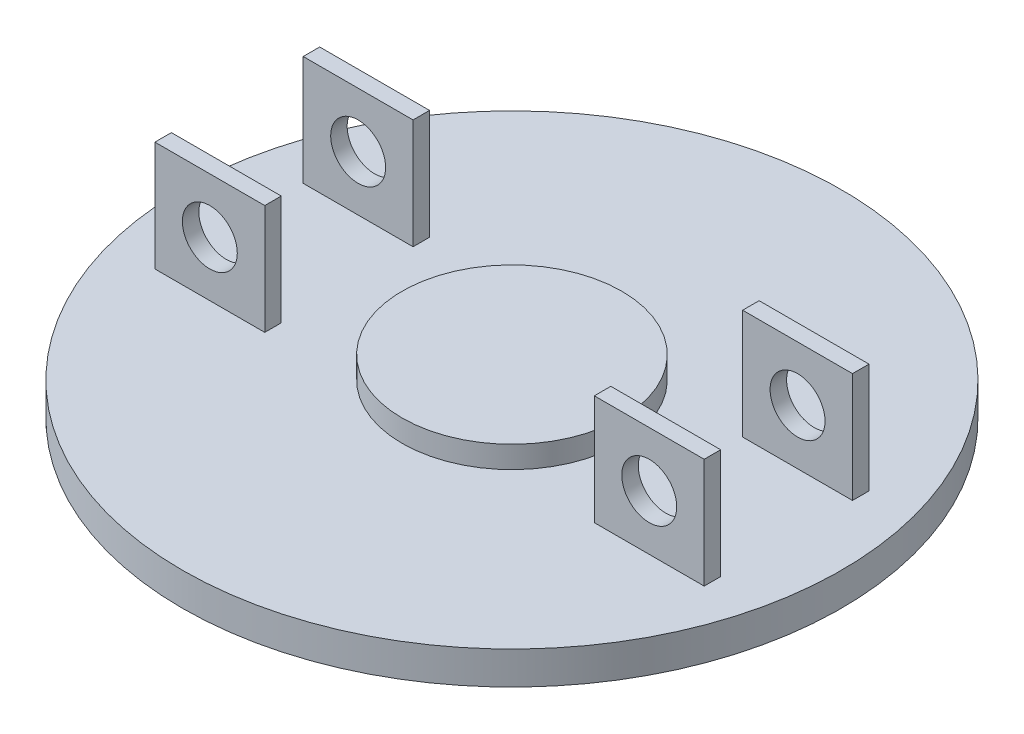
ISO-10303-21;
HEADER;
FILE_DESCRIPTION(('STEP AP214'),'2;1');
FILE_NAME('part.step','',(''),(''),'','','');
FILE_SCHEMA(('AUTOMOTIVE_DESIGN { 1 0 10303 214 1 1 1 1 }'));
ENDSEC;
DATA;
#1=APPLICATION_CONTEXT('core data for automotive mechanical design processes');
#2=APPLICATION_PROTOCOL_DEFINITION('international standard','automotive_design',2000,#1);
#3=PRODUCT_CONTEXT('',#1,'mechanical');
#4=PRODUCT('Part','Part','',(#3));
#5=PRODUCT_RELATED_PRODUCT_CATEGORY('part','',(#4));
#6=PRODUCT_DEFINITION_FORMATION('','',#4);
#7=PRODUCT_DEFINITION_CONTEXT('part definition',#1,'design');
#8=PRODUCT_DEFINITION('design','',#6,#7);
#9=PRODUCT_DEFINITION_SHAPE('','',#8);
#10=(LENGTH_UNIT() NAMED_UNIT(*) SI_UNIT(.MILLI.,.METRE.));
#11=(NAMED_UNIT(*) PLANE_ANGLE_UNIT() SI_UNIT($,.RADIAN.));
#12=(NAMED_UNIT(*) SI_UNIT($,.STERADIAN.) SOLID_ANGLE_UNIT());
#13=UNCERTAINTY_MEASURE_WITH_UNIT(LENGTH_MEASURE(1.E-05),#10,'distance_accuracy_value','');
#14=(GEOMETRIC_REPRESENTATION_CONTEXT(3) GLOBAL_UNCERTAINTY_ASSIGNED_CONTEXT((#13)) GLOBAL_UNIT_ASSIGNED_CONTEXT((#10,
#11,#12)) REPRESENTATION_CONTEXT('',''));
#15=CARTESIAN_POINT('',(0.,0.,0.));
#16=DIRECTION('',(0.,0.,1.));
#17=DIRECTION('',(1.,0.,0.));
#18=AXIS2_PLACEMENT_3D('',#15,#16,#17);
#19=CARTESIAN_POINT('',(-15.,13.,-7.5));
#20=DIRECTION('',(-1.,0.,0.));
#21=DIRECTION('',(0.,0.,1.));
#22=AXIS2_PLACEMENT_3D('',#19,#20,#21);
#23=PLANE('',#22);
#24=DIRECTION('',(0.,1.,0.));
#25=VECTOR('',#24,1.);
#26=CARTESIAN_POINT('',(-15.,3.,6.));
#27=LINE('',#26,#25);
#28=CARTESIAN_POINT('',(-15.,3.,6.));
#29=VERTEX_POINT('',#28);
#30=CARTESIAN_POINT('',(-15.,13.,6.));
#31=VERTEX_POINT('',#30);
#32=EDGE_CURVE('E241',#29,#31,#27,.T.);
#33=ORIENTED_EDGE('',*,*,#32,.T.);
#34=DIRECTION('',(0.,0.,-1.));
#35=VECTOR('',#34,1.);
#36=CARTESIAN_POINT('',(-15.,13.,-7.5));
#37=LINE('',#36,#35);
#38=CARTESIAN_POINT('',(-15.,13.,7.5));
#39=VERTEX_POINT('',#38);
#40=EDGE_CURVE('E297',#39,#31,#37,.T.);
#41=ORIENTED_EDGE('',*,*,#40,.F.);
#42=DIRECTION('',(0.,-1.,0.));
#43=VECTOR('',#42,1.);
#44=CARTESIAN_POINT('',(-15.,13.,7.5));
#45=LINE('',#44,#43);
#46=CARTESIAN_POINT('',(-15.,3.,7.5));
#47=VERTEX_POINT('',#46);
#48=EDGE_CURVE('E190',#39,#47,#45,.T.);
#49=ORIENTED_EDGE('',*,*,#48,.T.);
#50=DIRECTION('',(0.,0.,-1.));
#51=VECTOR('',#50,1.);
#52=CARTESIAN_POINT('',(-15.,3.,-7.5));
#53=LINE('',#52,#51);
#54=EDGE_CURVE('E305',#47,#29,#53,.T.);
#55=ORIENTED_EDGE('',*,*,#54,.T.);
#56=EDGE_LOOP('',(#33,#41,#49,#55));
#57=FACE_BOUND('',#56,.T.);
#58=ADVANCED_FACE('F40',(#57),#23,.F.);
#59=CARTESIAN_POINT('',(-25.,13.,-7.5));
#60=DIRECTION('',(1.,0.,0.));
#61=DIRECTION('',(0.,0.,-1.));
#62=AXIS2_PLACEMENT_3D('',#59,#60,#61);
#63=PLANE('',#62);
#64=DIRECTION('',(0.,-1.,0.));
#65=VECTOR('',#64,1.);
#66=CARTESIAN_POINT('',(-25.,3.,6.));
#67=LINE('',#66,#65);
#68=CARTESIAN_POINT('',(-25.,13.,6.));
#69=VERTEX_POINT('',#68);
#70=CARTESIAN_POINT('',(-25.,3.,6.));
#71=VERTEX_POINT('',#70);
#72=EDGE_CURVE('E57',#69,#71,#67,.T.);
#73=ORIENTED_EDGE('',*,*,#72,.T.);
#74=DIRECTION('',(0.,0.,1.));
#75=VECTOR('',#74,1.);
#76=CARTESIAN_POINT('',(-25.,3.,-7.5));
#77=LINE('',#76,#75);
#78=CARTESIAN_POINT('',(-25.,3.,7.5));
#79=VERTEX_POINT('',#78);
#80=EDGE_CURVE('E182',#71,#79,#77,.T.);
#81=ORIENTED_EDGE('',*,*,#80,.T.);
#82=DIRECTION('',(0.,-1.,0.));
#83=VECTOR('',#82,1.);
#84=CARTESIAN_POINT('',(-25.,13.,7.5));
#85=LINE('',#84,#83);
#86=CARTESIAN_POINT('',(-25.,13.,7.5));
#87=VERTEX_POINT('',#86);
#88=EDGE_CURVE('E193',#87,#79,#85,.T.);
#89=ORIENTED_EDGE('',*,*,#88,.F.);
#90=DIRECTION('',(0.,0.,1.));
#91=VECTOR('',#90,1.);
#92=CARTESIAN_POINT('',(-25.,13.,-7.5));
#93=LINE('',#92,#91);
#94=EDGE_CURVE('E302',#69,#87,#93,.T.);
#95=ORIENTED_EDGE('',*,*,#94,.F.);
#96=EDGE_LOOP('',(#73,#81,#89,#95));
#97=FACE_BOUND('',#96,.T.);
#98=ADVANCED_FACE('F335',(#97),#63,.F.);
#99=CARTESIAN_POINT('',(0.,13.,0.));
#100=DIRECTION('',(0.,1.,0.));
#101=DIRECTION('',(0.,0.,1.));
#102=AXIS2_PLACEMENT_3D('',#99,#100,#101);
#103=PLANE('',#102);
#104=ORIENTED_EDGE('',*,*,#40,.T.);
#105=DIRECTION('',(-1.,0.,0.));
#106=VECTOR('',#105,1.);
#107=CARTESIAN_POINT('',(-25.,13.,6.));
#108=LINE('',#107,#106);
#109=EDGE_CURVE('E175',#31,#69,#108,.T.);
#110=ORIENTED_EDGE('',*,*,#109,.T.);
#111=ORIENTED_EDGE('',*,*,#94,.T.);
#112=DIRECTION('',(1.,0.,0.));
#113=VECTOR('',#112,1.);
#114=CARTESIAN_POINT('',(-25.,13.,7.5));
#115=LINE('',#114,#113);
#116=EDGE_CURVE('E194',#87,#39,#115,.T.);
#117=ORIENTED_EDGE('',*,*,#116,.T.);
#118=EDGE_LOOP('',(#104,#110,#111,#117));
#119=FACE_BOUND('',#118,.T.);
#120=ADVANCED_FACE('F322',(#119),#103,.T.);
#121=CARTESIAN_POINT('',(25.,13.,-7.5));
#122=DIRECTION('',(-1.,0.,0.));
#123=DIRECTION('',(0.,0.,1.));
#124=AXIS2_PLACEMENT_3D('',#121,#122,#123);
#125=PLANE('',#124);
#126=DIRECTION('',(0.,1.,0.));
#127=VECTOR('',#126,1.);
#128=CARTESIAN_POINT('',(25.,3.,6.));
#129=LINE('',#128,#127);
#130=CARTESIAN_POINT('',(25.,3.,6.));
#131=VERTEX_POINT('',#130);
#132=CARTESIAN_POINT('',(25.,13.,6.));
#133=VERTEX_POINT('',#132);
#134=EDGE_CURVE('E247',#131,#133,#129,.T.);
#135=ORIENTED_EDGE('',*,*,#134,.T.);
#136=DIRECTION('',(0.,0.,-1.));
#137=VECTOR('',#136,1.);
#138=CARTESIAN_POINT('',(25.,13.,-7.5));
#139=LINE('',#138,#137);
#140=CARTESIAN_POINT('',(25.,13.,7.5));
#141=VERTEX_POINT('',#140);
#142=EDGE_CURVE('E277',#141,#133,#139,.T.);
#143=ORIENTED_EDGE('',*,*,#142,.F.);
#144=DIRECTION('',(0.,-1.,0.));
#145=VECTOR('',#144,1.);
#146=CARTESIAN_POINT('',(25.,13.,7.5));
#147=LINE('',#146,#145);
#148=CARTESIAN_POINT('',(25.,3.,7.5));
#149=VERTEX_POINT('',#148);
#150=EDGE_CURVE('E270',#141,#149,#147,.T.);
#151=ORIENTED_EDGE('',*,*,#150,.T.);
#152=DIRECTION('',(0.,0.,-1.));
#153=VECTOR('',#152,1.);
#154=CARTESIAN_POINT('',(25.,3.,-7.5));
#155=LINE('',#154,#153);
#156=EDGE_CURVE('E284',#149,#131,#155,.T.);
#157=ORIENTED_EDGE('',*,*,#156,.T.);
#158=EDGE_LOOP('',(#135,#143,#151,#157));
#159=FACE_BOUND('',#158,.T.);
#160=ADVANCED_FACE('F330',(#159),#125,.F.);
#161=CARTESIAN_POINT('',(15.,13.,-7.5));
#162=DIRECTION('',(1.,0.,0.));
#163=DIRECTION('',(0.,0.,-1.));
#164=AXIS2_PLACEMENT_3D('',#161,#162,#163);
#165=PLANE('',#164);
#166=DIRECTION('',(0.,-1.,0.));
#167=VECTOR('',#166,1.);
#168=CARTESIAN_POINT('',(15.,3.,6.));
#169=LINE('',#168,#167);
#170=CARTESIAN_POINT('',(15.,13.,6.));
#171=VERTEX_POINT('',#170);
#172=CARTESIAN_POINT('',(15.,3.,6.));
#173=VERTEX_POINT('',#172);
#174=EDGE_CURVE('E65',#171,#173,#169,.T.);
#175=ORIENTED_EDGE('',*,*,#174,.T.);
#176=DIRECTION('',(0.,0.,1.));
#177=VECTOR('',#176,1.);
#178=CARTESIAN_POINT('',(15.,3.,-7.5));
#179=LINE('',#178,#177);
#180=CARTESIAN_POINT('',(15.,3.,7.5));
#181=VERTEX_POINT('',#180);
#182=EDGE_CURVE('E276',#173,#181,#179,.T.);
#183=ORIENTED_EDGE('',*,*,#182,.T.);
#184=DIRECTION('',(0.,-1.,0.));
#185=VECTOR('',#184,1.);
#186=CARTESIAN_POINT('',(15.,13.,7.5));
#187=LINE('',#186,#185);
#188=CARTESIAN_POINT('',(15.,13.,7.5));
#189=VERTEX_POINT('',#188);
#190=EDGE_CURVE('E267',#189,#181,#187,.T.);
#191=ORIENTED_EDGE('',*,*,#190,.F.);
#192=DIRECTION('',(0.,0.,1.));
#193=VECTOR('',#192,1.);
#194=CARTESIAN_POINT('',(15.,13.,-7.5));
#195=LINE('',#194,#193);
#196=EDGE_CURVE('E288',#171,#189,#195,.T.);
#197=ORIENTED_EDGE('',*,*,#196,.F.);
#198=EDGE_LOOP('',(#175,#183,#191,#197));
#199=FACE_BOUND('',#198,.T.);
#200=ADVANCED_FACE('F387',(#199),#165,.F.);
#201=CARTESIAN_POINT('',(0.,13.,0.));
#202=DIRECTION('',(0.,1.,0.));
#203=DIRECTION('',(0.,0.,1.));
#204=AXIS2_PLACEMENT_3D('',#201,#202,#203);
#205=PLANE('',#204);
#206=ORIENTED_EDGE('',*,*,#142,.T.);
#207=DIRECTION('',(-1.,0.,0.));
#208=VECTOR('',#207,1.);
#209=CARTESIAN_POINT('',(15.,13.,6.));
#210=LINE('',#209,#208);
#211=EDGE_CURVE('E245',#133,#171,#210,.T.);
#212=ORIENTED_EDGE('',*,*,#211,.T.);
#213=ORIENTED_EDGE('',*,*,#196,.T.);
#214=DIRECTION('',(1.,0.,0.));
#215=VECTOR('',#214,1.);
#216=CARTESIAN_POINT('',(15.,13.,7.5));
#217=LINE('',#216,#215);
#218=EDGE_CURVE('E273',#189,#141,#217,.T.);
#219=ORIENTED_EDGE('',*,*,#218,.T.);
#220=EDGE_LOOP('',(#206,#212,#213,#219));
#221=FACE_BOUND('',#220,.T.);
#222=ADVANCED_FACE('F363',(#221),#205,.T.);
#223=CARTESIAN_POINT('',(0.,3.,0.));
#224=DIRECTION('',(0.,1.,0.));
#225=DIRECTION('',(0.,0.,1.));
#226=AXIS2_PLACEMENT_3D('',#223,#224,#225);
#227=PLANE('',#226);
#228=DIRECTION('',(1.,0.,0.));
#229=VECTOR('',#228,1.);
#230=CARTESIAN_POINT('',(-25.,3.,6.));
#231=LINE('',#230,#229);
#232=EDGE_CURVE('E238',#71,#29,#231,.T.);
#233=ORIENTED_EDGE('',*,*,#232,.T.);
#234=ORIENTED_EDGE('',*,*,#54,.F.);
#235=DIRECTION('',(1.,0.,0.));
#236=VECTOR('',#235,1.);
#237=CARTESIAN_POINT('',(-25.,3.,7.5));
#238=LINE('',#237,#236);
#239=EDGE_CURVE('E181',#79,#47,#238,.T.);
#240=ORIENTED_EDGE('',*,*,#239,.F.);
#241=ORIENTED_EDGE('',*,*,#80,.F.);
#242=EDGE_LOOP('',(#233,#234,#240,#241));
#243=FACE_BOUND('',#242,.T.);
#244=DIRECTION('',(1.,0.,0.));
#245=VECTOR('',#244,1.);
#246=CARTESIAN_POINT('',(15.,3.,6.));
#247=LINE('',#246,#245);
#248=EDGE_CURVE('E251',#173,#131,#247,.T.);
#249=ORIENTED_EDGE('',*,*,#248,.T.);
#250=ORIENTED_EDGE('',*,*,#156,.F.);
#251=DIRECTION('',(1.,0.,0.));
#252=VECTOR('',#251,1.);
#253=CARTESIAN_POINT('',(15.,3.,7.5));
#254=LINE('',#253,#252);
#255=EDGE_CURVE('E274',#181,#149,#254,.T.);
#256=ORIENTED_EDGE('',*,*,#255,.F.);
#257=ORIENTED_EDGE('',*,*,#182,.F.);
#258=EDGE_LOOP('',(#249,#250,#256,#257));
#259=FACE_BOUND('',#258,.T.);
#260=CARTESIAN_POINT('',(0.,3.,0.));
#261=DIRECTION('',(0.,1.,0.));
#262=DIRECTION('',(0.,0.,1.));
#263=AXIS2_PLACEMENT_3D('',#260,#261,#262);
#264=CIRCLE('',#263,10.);
#265=CARTESIAN_POINT('',(0.,3.,10.));
#266=VERTEX_POINT('',#265);
#267=EDGE_CURVE('E11',#266,#266,#264,.T.);
#268=ORIENTED_EDGE('',*,*,#267,.F.);
#269=EDGE_LOOP('',(#268));
#270=FACE_BOUND('',#269,.T.);
#271=CARTESIAN_POINT('',(0.,3.,0.));
#272=DIRECTION('',(0.,1.,0.));
#273=DIRECTION('',(0.,0.,1.));
#274=AXIS2_PLACEMENT_3D('',#271,#272,#273);
#275=CIRCLE('',#274,30.);
#276=CARTESIAN_POINT('',(0.,3.,30.));
#277=VERTEX_POINT('',#276);
#278=EDGE_CURVE('E49',#277,#277,#275,.T.);
#279=ORIENTED_EDGE('',*,*,#278,.T.);
#280=EDGE_LOOP('',(#279));
#281=FACE_BOUND('',#280,.T.);
#282=DIRECTION('',(-1.,0.,0.));
#283=VECTOR('',#282,1.);
#284=CARTESIAN_POINT('',(-25.,3.,-7.5));
#285=LINE('',#284,#283);
#286=CARTESIAN_POINT('',(-15.,3.,-7.5));
#287=VERTEX_POINT('',#286);
#288=CARTESIAN_POINT('',(-25.,3.,-7.5));
#289=VERTEX_POINT('',#288);
#290=EDGE_CURVE('E186',#287,#289,#285,.T.);
#291=ORIENTED_EDGE('',*,*,#290,.F.);
#292=CARTESIAN_POINT('',(-15.,3.,-6.));
#293=VERTEX_POINT('',#292);
#294=EDGE_CURVE('E162',#293,#287,#53,.T.);
#295=ORIENTED_EDGE('',*,*,#294,.F.);
#296=DIRECTION('',(1.,0.,0.));
#297=VECTOR('',#296,1.);
#298=CARTESIAN_POINT('',(-25.,3.,-6.));
#299=LINE('',#298,#297);
#300=CARTESIAN_POINT('',(-25.,3.,-6.));
#301=VERTEX_POINT('',#300);
#302=EDGE_CURVE('E155',#301,#293,#299,.T.);
#303=ORIENTED_EDGE('',*,*,#302,.F.);
#304=EDGE_CURVE('E161',#289,#301,#77,.T.);
#305=ORIENTED_EDGE('',*,*,#304,.F.);
#306=EDGE_LOOP('',(#291,#295,#303,#305));
#307=FACE_BOUND('',#306,.T.);
#308=DIRECTION('',(-1.,0.,0.));
#309=VECTOR('',#308,1.);
#310=CARTESIAN_POINT('',(15.,3.,-7.5));
#311=LINE('',#310,#309);
#312=CARTESIAN_POINT('',(25.,3.,-7.5));
#313=VERTEX_POINT('',#312);
#314=CARTESIAN_POINT('',(15.,3.,-7.5));
#315=VERTEX_POINT('',#314);
#316=EDGE_CURVE('E281',#313,#315,#311,.T.);
#317=ORIENTED_EDGE('',*,*,#316,.F.);
#318=CARTESIAN_POINT('',(25.,3.,-6.));
#319=VERTEX_POINT('',#318);
#320=EDGE_CURVE('E283',#319,#313,#155,.T.);
#321=ORIENTED_EDGE('',*,*,#320,.F.);
#322=DIRECTION('',(1.,0.,0.));
#323=VECTOR('',#322,1.);
#324=CARTESIAN_POINT('',(15.,3.,-6.));
#325=LINE('',#324,#323);
#326=CARTESIAN_POINT('',(15.,3.,-6.));
#327=VERTEX_POINT('',#326);
#328=EDGE_CURVE('E258',#327,#319,#325,.T.);
#329=ORIENTED_EDGE('',*,*,#328,.F.);
#330=EDGE_CURVE('E278',#315,#327,#179,.T.);
#331=ORIENTED_EDGE('',*,*,#330,.F.);
#332=EDGE_LOOP('',(#317,#321,#329,#331));
#333=FACE_BOUND('',#332,.T.);
#334=ADVANCED_FACE('F158',(#243,#259,#270,#281,#307,#333),#227,.T.);
#335=CARTESIAN_POINT('',(0.,3.,0.));
#336=DIRECTION('',(0.,-1.,0.));
#337=DIRECTION('',(0.,0.,-1.));
#338=AXIS2_PLACEMENT_3D('',#335,#336,#337);
#339=CYLINDRICAL_SURFACE('',#338,30.);
#340=ORIENTED_EDGE('',*,*,#278,.F.);
#341=EDGE_LOOP('',(#340));
#342=FACE_BOUND('',#341,.T.);
#343=CARTESIAN_POINT('',(0.,0.,0.));
#344=DIRECTION('',(0.,1.,0.));
#345=DIRECTION('',(0.,0.,1.));
#346=AXIS2_PLACEMENT_3D('',#343,#344,#345);
#347=CIRCLE('',#346,30.);
#348=CARTESIAN_POINT('',(0.,0.,30.));
#349=VERTEX_POINT('',#348);
#350=EDGE_CURVE('E203',#349,#349,#347,.T.);
#351=ORIENTED_EDGE('',*,*,#350,.T.);
#352=EDGE_LOOP('',(#351));
#353=FACE_BOUND('',#352,.T.);
#354=ADVANCED_FACE('F42',(#342,#353),#339,.T.);
#355=CARTESIAN_POINT('',(0.,0.,0.));
#356=DIRECTION('',(0.,1.,0.));
#357=DIRECTION('',(0.,0.,1.));
#358=AXIS2_PLACEMENT_3D('',#355,#356,#357);
#359=PLANE('',#358);
#360=ORIENTED_EDGE('',*,*,#350,.F.);
#361=EDGE_LOOP('',(#360));
#362=FACE_BOUND('',#361,.T.);
#363=ADVANCED_FACE('F358',(#362),#359,.F.);
#364=CARTESIAN_POINT('',(0.,5.,0.));
#365=DIRECTION('',(0.,-1.,0.));
#366=DIRECTION('',(0.,0.,-1.));
#367=AXIS2_PLACEMENT_3D('',#364,#365,#366);
#368=CYLINDRICAL_SURFACE('',#367,10.);
#369=CARTESIAN_POINT('',(0.,5.,0.));
#370=DIRECTION('',(0.,1.,0.));
#371=DIRECTION('',(0.,0.,1.));
#372=AXIS2_PLACEMENT_3D('',#369,#370,#371);
#373=CIRCLE('',#372,10.);
#374=CARTESIAN_POINT('',(0.,5.,10.));
#375=VERTEX_POINT('',#374);
#376=EDGE_CURVE('E201',#375,#375,#373,.T.);
#377=ORIENTED_EDGE('',*,*,#376,.F.);
#378=EDGE_LOOP('',(#377));
#379=FACE_BOUND('',#378,.T.);
#380=ORIENTED_EDGE('',*,*,#267,.T.);
#381=EDGE_LOOP('',(#380));
#382=FACE_BOUND('',#381,.T.);
#383=ADVANCED_FACE('F353',(#379,#382),#368,.T.);
#384=CARTESIAN_POINT('',(0.,5.,0.));
#385=DIRECTION('',(0.,1.,0.));
#386=DIRECTION('',(0.,0.,1.));
#387=AXIS2_PLACEMENT_3D('',#384,#385,#386);
#388=PLANE('',#387);
#389=ORIENTED_EDGE('',*,*,#376,.T.);
#390=EDGE_LOOP('',(#389));
#391=FACE_BOUND('',#390,.T.);
#392=ADVANCED_FACE('F347',(#391),#388,.T.);
#393=CARTESIAN_POINT('',(-15.,13.,-6.));
#394=VERTEX_POINT('',#393);
#395=CARTESIAN_POINT('',(-15.,13.,-7.5));
#396=VERTEX_POINT('',#395);
#397=EDGE_CURVE('E184',#394,#396,#37,.T.);
#398=ORIENTED_EDGE('',*,*,#397,.F.);
#399=DIRECTION('',(0.,1.,0.));
#400=VECTOR('',#399,1.);
#401=CARTESIAN_POINT('',(-15.,3.,-6.));
#402=LINE('',#401,#400);
#403=EDGE_CURVE('E165',#293,#394,#402,.T.);
#404=ORIENTED_EDGE('',*,*,#403,.F.);
#405=ORIENTED_EDGE('',*,*,#294,.T.);
#406=DIRECTION('',(0.,-1.,0.));
#407=VECTOR('',#406,1.);
#408=CARTESIAN_POINT('',(-15.,13.,-7.5));
#409=LINE('',#408,#407);
#410=EDGE_CURVE('E198',#396,#287,#409,.T.);
#411=ORIENTED_EDGE('',*,*,#410,.F.);
#412=EDGE_LOOP('',(#398,#404,#405,#411));
#413=FACE_BOUND('',#412,.T.);
#414=ADVANCED_FACE('F312',(#413),#23,.F.);
#415=CARTESIAN_POINT('',(-25.,13.,-7.5));
#416=DIRECTION('',(0.,0.,1.));
#417=DIRECTION('',(1.,0.,0.));
#418=AXIS2_PLACEMENT_3D('',#415,#416,#417);
#419=PLANE('',#418);
#420=CARTESIAN_POINT('',(-20.,8.,-7.5));
#421=DIRECTION('',(0.,0.,1.));
#422=DIRECTION('',(1.,0.,0.));
#423=AXIS2_PLACEMENT_3D('',#420,#421,#422);
#424=CIRCLE('',#423,2.5);
#425=CARTESIAN_POINT('',(-17.5,8.,-7.5));
#426=VERTEX_POINT('',#425);
#427=EDGE_CURVE('E215',#426,#426,#424,.T.);
#428=ORIENTED_EDGE('',*,*,#427,.T.);
#429=EDGE_LOOP('',(#428));
#430=FACE_BOUND('',#429,.T.);
#431=ORIENTED_EDGE('',*,*,#290,.T.);
#432=DIRECTION('',(0.,-1.,0.));
#433=VECTOR('',#432,1.);
#434=CARTESIAN_POINT('',(-25.,13.,-7.5));
#435=LINE('',#434,#433);
#436=CARTESIAN_POINT('',(-25.,13.,-7.5));
#437=VERTEX_POINT('',#436);
#438=EDGE_CURVE('E180',#437,#289,#435,.T.);
#439=ORIENTED_EDGE('',*,*,#438,.F.);
#440=DIRECTION('',(-1.,0.,0.));
#441=VECTOR('',#440,1.);
#442=CARTESIAN_POINT('',(-25.,13.,-7.5));
#443=LINE('',#442,#441);
#444=EDGE_CURVE('E300',#396,#437,#443,.T.);
#445=ORIENTED_EDGE('',*,*,#444,.F.);
#446=ORIENTED_EDGE('',*,*,#410,.T.);
#447=EDGE_LOOP('',(#431,#439,#445,#446));
#448=FACE_BOUND('',#447,.T.);
#449=ADVANCED_FACE('F315',(#430,#448),#419,.F.);
#450=ORIENTED_EDGE('',*,*,#304,.T.);
#451=DIRECTION('',(0.,-1.,0.));
#452=VECTOR('',#451,1.);
#453=CARTESIAN_POINT('',(-25.,3.,-6.));
#454=LINE('',#453,#452);
#455=CARTESIAN_POINT('',(-25.,13.,-6.));
#456=VERTEX_POINT('',#455);
#457=EDGE_CURVE('E166',#456,#301,#454,.T.);
#458=ORIENTED_EDGE('',*,*,#457,.F.);
#459=EDGE_CURVE('E303',#437,#456,#93,.T.);
#460=ORIENTED_EDGE('',*,*,#459,.F.);
#461=ORIENTED_EDGE('',*,*,#438,.T.);
#462=EDGE_LOOP('',(#450,#458,#460,#461));
#463=FACE_BOUND('',#462,.T.);
#464=ADVANCED_FACE('F178',(#463),#63,.F.);
#465=CARTESIAN_POINT('',(-25.,13.,7.5));
#466=DIRECTION('',(0.,0.,-1.));
#467=DIRECTION('',(-1.,0.,0.));
#468=AXIS2_PLACEMENT_3D('',#465,#466,#467);
#469=PLANE('',#468);
#470=CARTESIAN_POINT('',(-20.,8.,7.5));
#471=DIRECTION('',(0.,0.,1.));
#472=DIRECTION('',(1.,0.,0.));
#473=AXIS2_PLACEMENT_3D('',#470,#471,#472);
#474=CIRCLE('',#473,2.5);
#475=CARTESIAN_POINT('',(-17.5,8.,7.5));
#476=VERTEX_POINT('',#475);
#477=EDGE_CURVE('E218',#476,#476,#474,.T.);
#478=ORIENTED_EDGE('',*,*,#477,.F.);
#479=EDGE_LOOP('',(#478));
#480=FACE_BOUND('',#479,.T.);
#481=ORIENTED_EDGE('',*,*,#239,.T.);
#482=ORIENTED_EDGE('',*,*,#48,.F.);
#483=ORIENTED_EDGE('',*,*,#116,.F.);
#484=ORIENTED_EDGE('',*,*,#88,.T.);
#485=EDGE_LOOP('',(#481,#482,#483,#484));
#486=FACE_BOUND('',#485,.T.);
#487=ADVANCED_FACE('F320',(#480,#486),#469,.F.);
#488=DIRECTION('',(-1.,0.,0.));
#489=VECTOR('',#488,1.);
#490=CARTESIAN_POINT('',(-25.,13.,-6.));
#491=LINE('',#490,#489);
#492=EDGE_CURVE('E171',#394,#456,#491,.T.);
#493=ORIENTED_EDGE('',*,*,#492,.F.);
#494=ORIENTED_EDGE('',*,*,#397,.T.);
#495=ORIENTED_EDGE('',*,*,#444,.T.);
#496=ORIENTED_EDGE('',*,*,#459,.T.);
#497=EDGE_LOOP('',(#493,#494,#495,#496));
#498=FACE_BOUND('',#497,.T.);
#499=ADVANCED_FACE('F317',(#498),#103,.T.);
#500=CARTESIAN_POINT('',(25.,13.,-6.));
#501=VERTEX_POINT('',#500);
#502=CARTESIAN_POINT('',(25.,13.,-7.5));
#503=VERTEX_POINT('',#502);
#504=EDGE_CURVE('E294',#501,#503,#139,.T.);
#505=ORIENTED_EDGE('',*,*,#504,.F.);
#506=DIRECTION('',(0.,1.,0.));
#507=VECTOR('',#506,1.);
#508=CARTESIAN_POINT('',(25.,3.,-6.));
#509=LINE('',#508,#507);
#510=EDGE_CURVE('E256',#319,#501,#509,.T.);
#511=ORIENTED_EDGE('',*,*,#510,.F.);
#512=ORIENTED_EDGE('',*,*,#320,.T.);
#513=DIRECTION('',(0.,-1.,0.));
#514=VECTOR('',#513,1.);
#515=CARTESIAN_POINT('',(25.,13.,-7.5));
#516=LINE('',#515,#514);
#517=EDGE_CURVE('E236',#503,#313,#516,.T.);
#518=ORIENTED_EDGE('',*,*,#517,.F.);
#519=EDGE_LOOP('',(#505,#511,#512,#518));
#520=FACE_BOUND('',#519,.T.);
#521=ADVANCED_FACE('F319',(#520),#125,.F.);
#522=CARTESIAN_POINT('',(15.,13.,-7.5));
#523=DIRECTION('',(0.,0.,1.));
#524=DIRECTION('',(1.,0.,0.));
#525=AXIS2_PLACEMENT_3D('',#522,#523,#524);
#526=PLANE('',#525);
#527=CARTESIAN_POINT('',(20.,8.,-7.5));
#528=DIRECTION('',(0.,0.,1.));
#529=DIRECTION('',(1.,0.,0.));
#530=AXIS2_PLACEMENT_3D('',#527,#528,#529);
#531=CIRCLE('',#530,2.5);
#532=CARTESIAN_POINT('',(22.5,8.,-7.5));
#533=VERTEX_POINT('',#532);
#534=EDGE_CURVE('E230',#533,#533,#531,.T.);
#535=ORIENTED_EDGE('',*,*,#534,.T.);
#536=EDGE_LOOP('',(#535));
#537=FACE_BOUND('',#536,.T.);
#538=ORIENTED_EDGE('',*,*,#316,.T.);
#539=DIRECTION('',(0.,-1.,0.));
#540=VECTOR('',#539,1.);
#541=CARTESIAN_POINT('',(15.,13.,-7.5));
#542=LINE('',#541,#540);
#543=CARTESIAN_POINT('',(15.,13.,-7.5));
#544=VERTEX_POINT('',#543);
#545=EDGE_CURVE('E264',#544,#315,#542,.T.);
#546=ORIENTED_EDGE('',*,*,#545,.F.);
#547=DIRECTION('',(-1.,0.,0.));
#548=VECTOR('',#547,1.);
#549=CARTESIAN_POINT('',(15.,13.,-7.5));
#550=LINE('',#549,#548);
#551=EDGE_CURVE('E292',#503,#544,#550,.T.);
#552=ORIENTED_EDGE('',*,*,#551,.F.);
#553=ORIENTED_EDGE('',*,*,#517,.T.);
#554=EDGE_LOOP('',(#538,#546,#552,#553));
#555=FACE_BOUND('',#554,.T.);
#556=ADVANCED_FACE('F327',(#537,#555),#526,.F.);
#557=ORIENTED_EDGE('',*,*,#330,.T.);
#558=DIRECTION('',(0.,-1.,0.));
#559=VECTOR('',#558,1.);
#560=CARTESIAN_POINT('',(15.,3.,-6.));
#561=LINE('',#560,#559);
#562=CARTESIAN_POINT('',(15.,13.,-6.));
#563=VERTEX_POINT('',#562);
#564=EDGE_CURVE('E248',#563,#327,#561,.T.);
#565=ORIENTED_EDGE('',*,*,#564,.F.);
#566=EDGE_CURVE('E289',#544,#563,#195,.T.);
#567=ORIENTED_EDGE('',*,*,#566,.F.);
#568=ORIENTED_EDGE('',*,*,#545,.T.);
#569=EDGE_LOOP('',(#557,#565,#567,#568));
#570=FACE_BOUND('',#569,.T.);
#571=ADVANCED_FACE('F397',(#570),#165,.F.);
#572=CARTESIAN_POINT('',(15.,13.,7.5));
#573=DIRECTION('',(0.,0.,-1.));
#574=DIRECTION('',(-1.,0.,0.));
#575=AXIS2_PLACEMENT_3D('',#572,#573,#574);
#576=PLANE('',#575);
#577=CARTESIAN_POINT('',(20.,8.,7.5));
#578=DIRECTION('',(0.,0.,1.));
#579=DIRECTION('',(1.,0.,0.));
#580=AXIS2_PLACEMENT_3D('',#577,#578,#579);
#581=CIRCLE('',#580,2.5);
#582=CARTESIAN_POINT('',(22.5,8.,7.5));
#583=VERTEX_POINT('',#582);
#584=EDGE_CURVE('E211',#583,#583,#581,.T.);
#585=ORIENTED_EDGE('',*,*,#584,.F.);
#586=EDGE_LOOP('',(#585));
#587=FACE_BOUND('',#586,.T.);
#588=ORIENTED_EDGE('',*,*,#255,.T.);
#589=ORIENTED_EDGE('',*,*,#150,.F.);
#590=ORIENTED_EDGE('',*,*,#218,.F.);
#591=ORIENTED_EDGE('',*,*,#190,.T.);
#592=EDGE_LOOP('',(#588,#589,#590,#591));
#593=FACE_BOUND('',#592,.T.);
#594=ADVANCED_FACE('F499',(#587,#593),#576,.F.);
#595=DIRECTION('',(-1.,0.,0.));
#596=VECTOR('',#595,1.);
#597=CARTESIAN_POINT('',(15.,13.,-6.));
#598=LINE('',#597,#596);
#599=EDGE_CURVE('E232',#501,#563,#598,.T.);
#600=ORIENTED_EDGE('',*,*,#599,.F.);
#601=ORIENTED_EDGE('',*,*,#504,.T.);
#602=ORIENTED_EDGE('',*,*,#551,.T.);
#603=ORIENTED_EDGE('',*,*,#566,.T.);
#604=EDGE_LOOP('',(#600,#601,#602,#603));
#605=FACE_BOUND('',#604,.T.);
#606=ADVANCED_FACE('F389',(#605),#205,.T.);
#607=CARTESIAN_POINT('',(0.,0.,-6.));
#608=DIRECTION('',(0.,0.,-1.));
#609=DIRECTION('',(-1.,0.,0.));
#610=AXIS2_PLACEMENT_3D('',#607,#608,#609);
#611=PLANE('',#610);
#612=CARTESIAN_POINT('',(20.,8.,-6.));
#613=DIRECTION('',(0.,0.,-1.));
#614=DIRECTION('',(-1.,0.,0.));
#615=AXIS2_PLACEMENT_3D('',#612,#613,#614);
#616=CIRCLE('',#615,2.5);
#617=CARTESIAN_POINT('',(17.5,8.,-6.));
#618=VERTEX_POINT('',#617);
#619=EDGE_CURVE('E227',#618,#618,#616,.T.);
#620=ORIENTED_EDGE('',*,*,#619,.T.);
#621=EDGE_LOOP('',(#620));
#622=FACE_BOUND('',#621,.T.);
#623=ORIENTED_EDGE('',*,*,#564,.T.);
#624=ORIENTED_EDGE('',*,*,#328,.T.);
#625=ORIENTED_EDGE('',*,*,#510,.T.);
#626=ORIENTED_EDGE('',*,*,#599,.T.);
#627=EDGE_LOOP('',(#623,#624,#625,#626));
#628=FACE_BOUND('',#627,.T.);
#629=ADVANCED_FACE('F516',(#622,#628),#611,.F.);
#630=CARTESIAN_POINT('',(0.,0.,6.));
#631=DIRECTION('',(0.,0.,-1.));
#632=DIRECTION('',(-1.,0.,0.));
#633=AXIS2_PLACEMENT_3D('',#630,#631,#632);
#634=PLANE('',#633);
#635=CARTESIAN_POINT('',(20.,8.,6.00000000000001));
#636=DIRECTION('',(0.,0.,-1.));
#637=DIRECTION('',(-1.,0.,0.));
#638=AXIS2_PLACEMENT_3D('',#635,#636,#637);
#639=CIRCLE('',#638,2.5);
#640=CARTESIAN_POINT('',(17.5,8.,6.00000000000001));
#641=VERTEX_POINT('',#640);
#642=EDGE_CURVE('E44',#641,#641,#639,.T.);
#643=ORIENTED_EDGE('',*,*,#642,.F.);
#644=EDGE_LOOP('',(#643));
#645=FACE_BOUND('',#644,.T.);
#646=ORIENTED_EDGE('',*,*,#174,.F.);
#647=ORIENTED_EDGE('',*,*,#211,.F.);
#648=ORIENTED_EDGE('',*,*,#134,.F.);
#649=ORIENTED_EDGE('',*,*,#248,.F.);
#650=EDGE_LOOP('',(#646,#647,#648,#649));
#651=FACE_BOUND('',#650,.T.);
#652=ADVANCED_FACE('F551',(#645,#651),#634,.T.);
#653=CARTESIAN_POINT('',(0.,0.,-6.));
#654=DIRECTION('',(0.,0.,-1.));
#655=DIRECTION('',(-1.,0.,0.));
#656=AXIS2_PLACEMENT_3D('',#653,#654,#655);
#657=PLANE('',#656);
#658=CARTESIAN_POINT('',(-20.,8.,-6.));
#659=DIRECTION('',(0.,0.,-1.));
#660=DIRECTION('',(-1.,0.,0.));
#661=AXIS2_PLACEMENT_3D('',#658,#659,#660);
#662=CIRCLE('',#661,2.5);
#663=CARTESIAN_POINT('',(-22.5,8.,-6.));
#664=VERTEX_POINT('',#663);
#665=EDGE_CURVE('E210',#664,#664,#662,.T.);
#666=ORIENTED_EDGE('',*,*,#665,.T.);
#667=EDGE_LOOP('',(#666));
#668=FACE_BOUND('',#667,.T.);
#669=ORIENTED_EDGE('',*,*,#457,.T.);
#670=ORIENTED_EDGE('',*,*,#302,.T.);
#671=ORIENTED_EDGE('',*,*,#403,.T.);
#672=ORIENTED_EDGE('',*,*,#492,.T.);
#673=EDGE_LOOP('',(#669,#670,#671,#672));
#674=FACE_BOUND('',#673,.T.);
#675=ADVANCED_FACE('F169',(#668,#674),#657,.F.);
#676=CARTESIAN_POINT('',(0.,0.,6.));
#677=DIRECTION('',(0.,0.,-1.));
#678=DIRECTION('',(-1.,0.,0.));
#679=AXIS2_PLACEMENT_3D('',#676,#677,#678);
#680=PLANE('',#679);
#681=CARTESIAN_POINT('',(-20.,8.,6.00000000000001));
#682=DIRECTION('',(0.,0.,-1.));
#683=DIRECTION('',(-1.,0.,0.));
#684=AXIS2_PLACEMENT_3D('',#681,#682,#683);
#685=CIRCLE('',#684,2.5);
#686=CARTESIAN_POINT('',(-22.5,8.,6.00000000000001));
#687=VERTEX_POINT('',#686);
#688=EDGE_CURVE('E208',#687,#687,#685,.T.);
#689=ORIENTED_EDGE('',*,*,#688,.F.);
#690=EDGE_LOOP('',(#689));
#691=FACE_BOUND('',#690,.T.);
#692=ORIENTED_EDGE('',*,*,#72,.F.);
#693=ORIENTED_EDGE('',*,*,#109,.F.);
#694=ORIENTED_EDGE('',*,*,#32,.F.);
#695=ORIENTED_EDGE('',*,*,#232,.F.);
#696=EDGE_LOOP('',(#692,#693,#694,#695));
#697=FACE_BOUND('',#696,.T.);
#698=ADVANCED_FACE('F572',(#691,#697),#680,.T.);
#699=CARTESIAN_POINT('',(-20.,8.,-30.));
#700=DIRECTION('',(0.,0.,1.));
#701=DIRECTION('',(1.,0.,0.));
#702=AXIS2_PLACEMENT_3D('',#699,#700,#701);
#703=CYLINDRICAL_SURFACE('',#702,2.5);
#704=ORIENTED_EDGE('',*,*,#688,.T.);
#705=EDGE_LOOP('',(#704));
#706=FACE_BOUND('',#705,.T.);
#707=ORIENTED_EDGE('',*,*,#477,.T.);
#708=EDGE_LOOP('',(#707));
#709=FACE_BOUND('',#708,.T.);
#710=ADVANCED_FACE('F583',(#706,#709),#703,.F.);
#711=ORIENTED_EDGE('',*,*,#665,.F.);
#712=EDGE_LOOP('',(#711));
#713=FACE_BOUND('',#712,.T.);
#714=ORIENTED_EDGE('',*,*,#427,.F.);
#715=EDGE_LOOP('',(#714));
#716=FACE_BOUND('',#715,.T.);
#717=ADVANCED_FACE('F594',(#713,#716),#703,.F.);
#718=CARTESIAN_POINT('',(20.,8.,-30.));
#719=DIRECTION('',(0.,0.,1.));
#720=DIRECTION('',(1.,0.,0.));
#721=AXIS2_PLACEMENT_3D('',#718,#719,#720);
#722=CYLINDRICAL_SURFACE('',#721,2.5);
#723=ORIENTED_EDGE('',*,*,#642,.T.);
#724=EDGE_LOOP('',(#723));
#725=FACE_BOUND('',#724,.T.);
#726=ORIENTED_EDGE('',*,*,#584,.T.);
#727=EDGE_LOOP('',(#726));
#728=FACE_BOUND('',#727,.T.);
#729=ADVANCED_FACE('F604',(#725,#728),#722,.F.);
#730=ORIENTED_EDGE('',*,*,#619,.F.);
#731=EDGE_LOOP('',(#730));
#732=FACE_BOUND('',#731,.T.);
#733=ORIENTED_EDGE('',*,*,#534,.F.);
#734=EDGE_LOOP('',(#733));
#735=FACE_BOUND('',#734,.T.);
#736=ADVANCED_FACE('F614',(#732,#735),#722,.F.);
#737=CLOSED_SHELL('',(#58,#98,#120,#160,#200,#222,#334,#354,#363,#383,#392,#414,#449,#464,#487,
#499,#521,#556,#571,#594,#606,#629,#652,#675,#698,#710,#717,#729,#736));
#738=MANIFOLD_SOLID_BREP('B2',#737);
#739=ADVANCED_BREP_SHAPE_REPRESENTATION('',(#18,#738),#14);
#740=SHAPE_DEFINITION_REPRESENTATION(#9,#739);
ENDSEC;
END-ISO-10303-21;
